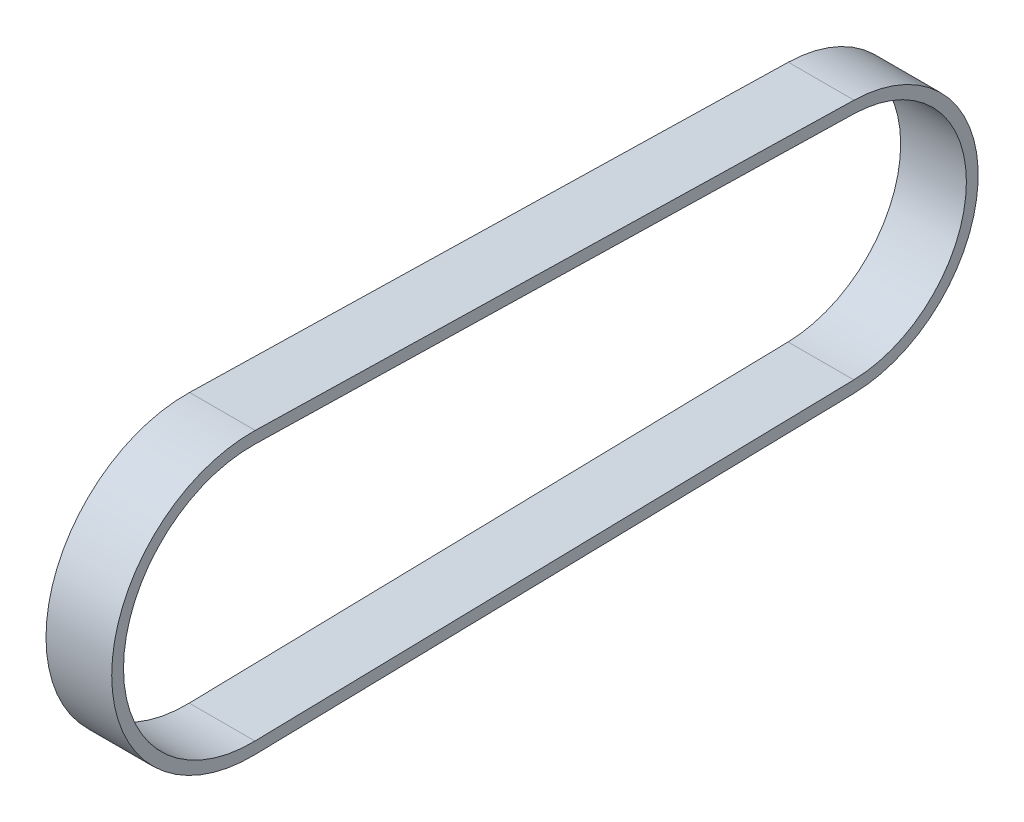
ISO-10303-21;
HEADER;
FILE_DESCRIPTION(('STEP AP214'),'2;1');
FILE_NAME('part.step','',(''),(''),'','','');
FILE_SCHEMA(('AUTOMOTIVE_DESIGN { 1 0 10303 214 1 1 1 1 }'));
ENDSEC;
DATA;
#1=APPLICATION_CONTEXT('core data for automotive mechanical design processes');
#2=APPLICATION_PROTOCOL_DEFINITION('international standard','automotive_design',2000,#1);
#3=PRODUCT_CONTEXT('',#1,'mechanical');
#4=PRODUCT('Part','Part','',(#3));
#5=PRODUCT_RELATED_PRODUCT_CATEGORY('part','',(#4));
#6=PRODUCT_DEFINITION_FORMATION('','',#4);
#7=PRODUCT_DEFINITION_CONTEXT('part definition',#1,'design');
#8=PRODUCT_DEFINITION('design','',#6,#7);
#9=PRODUCT_DEFINITION_SHAPE('','',#8);
#10=(LENGTH_UNIT() NAMED_UNIT(*) SI_UNIT(.MILLI.,.METRE.));
#11=(NAMED_UNIT(*) PLANE_ANGLE_UNIT() SI_UNIT($,.RADIAN.));
#12=(NAMED_UNIT(*) SI_UNIT($,.STERADIAN.) SOLID_ANGLE_UNIT());
#13=UNCERTAINTY_MEASURE_WITH_UNIT(LENGTH_MEASURE(1.E-05),#10,'distance_accuracy_value','');
#14=(GEOMETRIC_REPRESENTATION_CONTEXT(3) GLOBAL_UNCERTAINTY_ASSIGNED_CONTEXT((#13)) GLOBAL_UNIT_ASSIGNED_CONTEXT((#10,
#11,#12)) REPRESENTATION_CONTEXT('',''));
#15=CARTESIAN_POINT('',(0.,0.,0.));
#16=DIRECTION('',(0.,0.,1.));
#17=DIRECTION('',(1.,0.,0.));
#18=AXIS2_PLACEMENT_3D('',#15,#16,#17);
#19=CARTESIAN_POINT('',(6.35,0.,0.));
#20=DIRECTION('',(-1.,0.,0.));
#21=DIRECTION('',(0.,0.,1.));
#22=AXIS2_PLACEMENT_3D('',#19,#20,#21);
#23=PLANE('',#22);
#24=CARTESIAN_POINT('',(6.35,0.,0.));
#25=DIRECTION('',(1.,0.,0.));
#26=DIRECTION('',(0.,0.,1.));
#27=AXIS2_PLACEMENT_3D('',#24,#25,#26);
#28=CIRCLE('',#27,13.5661137745093);
#29=CARTESIAN_POINT('',(6.35,13.5627271504832,-0.303109195629552));
#30=VERTEX_POINT('',#29);
#31=CARTESIAN_POINT('',(6.35,-13.5627271504832,-0.303109195629544));
#32=VERTEX_POINT('',#31);
#33=EDGE_CURVE('E135',#30,#32,#28,.T.);
#34=ORIENTED_EDGE('',*,*,#33,.T.);
#35=DIRECTION('',(0.,0.0223431117170117,-0.999750361519715));
#36=VECTOR('',#35,1.);
#37=CARTESIAN_POINT('',(6.35,-12.2694387082106,-58.171753639046));
#38=LINE('',#37,#36);
#39=CARTESIAN_POINT('',(6.35,-12.2694387082106,-58.171753639046));
#40=VERTEX_POINT('',#39);
#41=EDGE_CURVE('E138',#32,#40,#38,.T.);
#42=ORIENTED_EDGE('',*,*,#41,.T.);
#43=CARTESIAN_POINT('',(6.35,0.,-57.8975477469412));
#44=DIRECTION('',(1.,0.,0.));
#45=DIRECTION('',(0.,0.,1.));
#46=AXIS2_PLACEMENT_3D('',#43,#44,#45);
#47=CIRCLE('',#46,12.2725023970583);
#48=CARTESIAN_POINT('',(6.35,12.2694387082106,-58.171753639046));
#49=VERTEX_POINT('',#48);
#50=EDGE_CURVE('E141',#40,#49,#47,.T.);
#51=ORIENTED_EDGE('',*,*,#50,.T.);
#52=DIRECTION('',(0.,0.0223431117170117,0.999750361519715));
#53=VECTOR('',#52,1.);
#54=CARTESIAN_POINT('',(6.35,13.5627271504832,-0.303109195629552));
#55=LINE('',#54,#53);
#56=EDGE_CURVE('E143',#49,#30,#55,.T.);
#57=ORIENTED_EDGE('',*,*,#56,.T.);
#58=EDGE_LOOP('',(#34,#42,#51,#57));
#59=FACE_BOUND('',#58,.T.);
#60=CARTESIAN_POINT('',(6.35,0.,0.));
#61=DIRECTION('',(1.,0.,0.));
#62=DIRECTION('',(0.,0.,1.));
#63=AXIS2_PLACEMENT_3D('',#60,#61,#62);
#64=CIRCLE('',#63,12.4261137745093);
#65=CARTESIAN_POINT('',(6.35,12.4230117383507,-0.277638048272158));
#66=VERTEX_POINT('',#65);
#67=CARTESIAN_POINT('',(6.35,-12.4230117383507,-0.277638048272151));
#68=VERTEX_POINT('',#67);
#69=EDGE_CURVE('E99',#66,#68,#64,.T.);
#70=ORIENTED_EDGE('',*,*,#69,.F.);
#71=DIRECTION('',(0.,0.0223431117170117,0.999750361519715));
#72=VECTOR('',#71,1.);
#73=CARTESIAN_POINT('',(6.35,12.4230117383507,-0.277638048272158));
#74=LINE('',#73,#72);
#75=CARTESIAN_POINT('',(6.35,11.1297232960782,-58.1462824916886));
#76=VERTEX_POINT('',#75);
#77=EDGE_CURVE('E121',#76,#66,#74,.T.);
#78=ORIENTED_EDGE('',*,*,#77,.F.);
#79=CARTESIAN_POINT('',(6.35,0.,-57.8975477469412));
#80=DIRECTION('',(1.,0.,0.));
#81=DIRECTION('',(0.,0.,1.));
#82=AXIS2_PLACEMENT_3D('',#79,#80,#81);
#83=CIRCLE('',#82,11.1325023970583);
#84=CARTESIAN_POINT('',(6.35,-11.1297232960782,-58.1462824916886));
#85=VERTEX_POINT('',#84);
#86=EDGE_CURVE('E119',#85,#76,#83,.T.);
#87=ORIENTED_EDGE('',*,*,#86,.F.);
#88=DIRECTION('',(0.,0.0223431117170117,-0.999750361519715));
#89=VECTOR('',#88,1.);
#90=CARTESIAN_POINT('',(6.35,-11.1297232960782,-58.1462824916886));
#91=LINE('',#90,#89);
#92=EDGE_CURVE('E107',#68,#85,#91,.T.);
#93=ORIENTED_EDGE('',*,*,#92,.F.);
#94=EDGE_LOOP('',(#70,#78,#87,#93));
#95=FACE_BOUND('',#94,.T.);
#96=ADVANCED_FACE('F34',(#59,#95),#23,.F.);
#97=CARTESIAN_POINT('',(0.,0.,0.));
#98=DIRECTION('',(-1.,0.,0.));
#99=DIRECTION('',(0.,0.,1.));
#100=AXIS2_PLACEMENT_3D('',#97,#98,#99);
#101=PLANE('',#100);
#102=CARTESIAN_POINT('',(0.,0.,0.));
#103=DIRECTION('',(1.,0.,0.));
#104=DIRECTION('',(0.,0.,1.));
#105=AXIS2_PLACEMENT_3D('',#102,#103,#104);
#106=CIRCLE('',#105,13.5661137745093);
#107=CARTESIAN_POINT('',(0.,13.5627271504832,-0.303109195629552));
#108=VERTEX_POINT('',#107);
#109=CARTESIAN_POINT('',(0.,-13.5627271504832,-0.303109195629544));
#110=VERTEX_POINT('',#109);
#111=EDGE_CURVE('E115',#108,#110,#106,.T.);
#112=ORIENTED_EDGE('',*,*,#111,.F.);
#113=DIRECTION('',(0.,0.0223431117170117,0.999750361519715));
#114=VECTOR('',#113,1.);
#115=CARTESIAN_POINT('',(0.,13.5627271504832,-0.303109195629552));
#116=LINE('',#115,#114);
#117=CARTESIAN_POINT('',(0.,12.2694387082106,-58.171753639046));
#118=VERTEX_POINT('',#117);
#119=EDGE_CURVE('E139',#118,#108,#116,.T.);
#120=ORIENTED_EDGE('',*,*,#119,.F.);
#121=CARTESIAN_POINT('',(0.,0.,-57.8975477469412));
#122=DIRECTION('',(1.,0.,0.));
#123=DIRECTION('',(0.,0.,1.));
#124=AXIS2_PLACEMENT_3D('',#121,#122,#123);
#125=CIRCLE('',#124,12.2725023970583);
#126=CARTESIAN_POINT('',(0.,-12.2694387082106,-58.171753639046));
#127=VERTEX_POINT('',#126);
#128=EDGE_CURVE('E150',#127,#118,#125,.T.);
#129=ORIENTED_EDGE('',*,*,#128,.F.);
#130=DIRECTION('',(0.,0.0223431117170117,-0.999750361519715));
#131=VECTOR('',#130,1.);
#132=CARTESIAN_POINT('',(0.,-12.2694387082106,-58.171753639046));
#133=LINE('',#132,#131);
#134=EDGE_CURVE('E148',#110,#127,#133,.T.);
#135=ORIENTED_EDGE('',*,*,#134,.F.);
#136=EDGE_LOOP('',(#112,#120,#129,#135));
#137=FACE_BOUND('',#136,.T.);
#138=DIRECTION('',(0.,0.0223431117170117,0.999750361519715));
#139=VECTOR('',#138,1.);
#140=CARTESIAN_POINT('',(0.,12.4230117383507,-0.277638048272158));
#141=LINE('',#140,#139);
#142=CARTESIAN_POINT('',(0.,11.1297232960782,-58.1462824916886));
#143=VERTEX_POINT('',#142);
#144=CARTESIAN_POINT('',(0.,12.4230117383507,-0.277638048272158));
#145=VERTEX_POINT('',#144);
#146=EDGE_CURVE('E108',#143,#145,#141,.T.);
#147=ORIENTED_EDGE('',*,*,#146,.T.);
#148=CARTESIAN_POINT('',(0.,0.,0.));
#149=DIRECTION('',(1.,0.,0.));
#150=DIRECTION('',(0.,0.,1.));
#151=AXIS2_PLACEMENT_3D('',#148,#149,#150);
#152=CIRCLE('',#151,12.4261137745093);
#153=CARTESIAN_POINT('',(0.,-12.4230117383507,-0.277638048272151));
#154=VERTEX_POINT('',#153);
#155=EDGE_CURVE('E57',#145,#154,#152,.T.);
#156=ORIENTED_EDGE('',*,*,#155,.T.);
#157=DIRECTION('',(0.,0.0223431117170117,-0.999750361519715));
#158=VECTOR('',#157,1.);
#159=CARTESIAN_POINT('',(0.,-11.1297232960782,-58.1462824916886));
#160=LINE('',#159,#158);
#161=CARTESIAN_POINT('',(0.,-11.1297232960782,-58.1462824916886));
#162=VERTEX_POINT('',#161);
#163=EDGE_CURVE('E114',#154,#162,#160,.T.);
#164=ORIENTED_EDGE('',*,*,#163,.T.);
#165=CARTESIAN_POINT('',(0.,0.,-57.8975477469412));
#166=DIRECTION('',(1.,0.,0.));
#167=DIRECTION('',(0.,0.,1.));
#168=AXIS2_PLACEMENT_3D('',#165,#166,#167);
#169=CIRCLE('',#168,11.1325023970583);
#170=EDGE_CURVE('E127',#162,#143,#169,.T.);
#171=ORIENTED_EDGE('',*,*,#170,.T.);
#172=EDGE_LOOP('',(#147,#156,#164,#171));
#173=FACE_BOUND('',#172,.T.);
#174=ADVANCED_FACE('F168',(#137,#173),#101,.T.);
#175=CARTESIAN_POINT('',(6.35,0.,0.));
#176=DIRECTION('',(-1.,0.,0.));
#177=DIRECTION('',(0.,0.,1.));
#178=AXIS2_PLACEMENT_3D('',#175,#176,#177);
#179=CYLINDRICAL_SURFACE('',#178,13.5661137745093);
#180=ORIENTED_EDGE('',*,*,#111,.T.);
#181=DIRECTION('',(-1.,0.,0.));
#182=VECTOR('',#181,1.);
#183=CARTESIAN_POINT('',(6.35,-13.5627271504832,-0.303109195629544));
#184=LINE('',#183,#182);
#185=EDGE_CURVE('E11',#32,#110,#184,.T.);
#186=ORIENTED_EDGE('',*,*,#185,.F.);
#187=ORIENTED_EDGE('',*,*,#33,.F.);
#188=DIRECTION('',(-1.,0.,0.));
#189=VECTOR('',#188,1.);
#190=CARTESIAN_POINT('',(6.35,13.5627271504832,-0.303109195629552));
#191=LINE('',#190,#189);
#192=EDGE_CURVE('E145',#30,#108,#191,.T.);
#193=ORIENTED_EDGE('',*,*,#192,.T.);
#194=EDGE_LOOP('',(#180,#186,#187,#193));
#195=FACE_BOUND('',#194,.T.);
#196=ADVANCED_FACE('F36',(#195),#179,.T.);
#197=CARTESIAN_POINT('',(6.35,-12.2694387082106,-58.171753639046));
#198=DIRECTION('',(0.,0.999750361519715,0.0223431117170117));
#199=DIRECTION('',(0.,-0.0223431117170117,0.999750361519715));
#200=AXIS2_PLACEMENT_3D('',#197,#198,#199);
#201=PLANE('',#200);
#202=ORIENTED_EDGE('',*,*,#134,.T.);
#203=DIRECTION('',(-1.,0.,0.));
#204=VECTOR('',#203,1.);
#205=CARTESIAN_POINT('',(6.35,-12.2694387082106,-58.171753639046));
#206=LINE('',#205,#204);
#207=EDGE_CURVE('E42',#40,#127,#206,.T.);
#208=ORIENTED_EDGE('',*,*,#207,.F.);
#209=ORIENTED_EDGE('',*,*,#41,.F.);
#210=ORIENTED_EDGE('',*,*,#185,.T.);
#211=EDGE_LOOP('',(#202,#208,#209,#210));
#212=FACE_BOUND('',#211,.T.);
#213=ADVANCED_FACE('F178',(#212),#201,.F.);
#214=CARTESIAN_POINT('',(6.35,0.,-57.8975477469412));
#215=DIRECTION('',(-1.,0.,0.));
#216=DIRECTION('',(0.,0.,1.));
#217=AXIS2_PLACEMENT_3D('',#214,#215,#216);
#218=CYLINDRICAL_SURFACE('',#217,12.2725023970583);
#219=ORIENTED_EDGE('',*,*,#128,.T.);
#220=DIRECTION('',(-1.,0.,0.));
#221=VECTOR('',#220,1.);
#222=CARTESIAN_POINT('',(6.35,12.2694387082106,-58.171753639046));
#223=LINE('',#222,#221);
#224=EDGE_CURVE('E155',#49,#118,#223,.T.);
#225=ORIENTED_EDGE('',*,*,#224,.F.);
#226=ORIENTED_EDGE('',*,*,#50,.F.);
#227=ORIENTED_EDGE('',*,*,#207,.T.);
#228=EDGE_LOOP('',(#219,#225,#226,#227));
#229=FACE_BOUND('',#228,.T.);
#230=ADVANCED_FACE('F162',(#229),#218,.T.);
#231=CARTESIAN_POINT('',(6.35,13.5627271504832,-0.303109195629552));
#232=DIRECTION('',(0.,-0.999750361519715,0.0223431117170117));
#233=DIRECTION('',(0.,-0.0223431117170117,-0.999750361519715));
#234=AXIS2_PLACEMENT_3D('',#231,#232,#233);
#235=PLANE('',#234);
#236=ORIENTED_EDGE('',*,*,#119,.T.);
#237=ORIENTED_EDGE('',*,*,#192,.F.);
#238=ORIENTED_EDGE('',*,*,#56,.F.);
#239=ORIENTED_EDGE('',*,*,#224,.T.);
#240=EDGE_LOOP('',(#236,#237,#238,#239));
#241=FACE_BOUND('',#240,.T.);
#242=ADVANCED_FACE('F172',(#241),#235,.F.);
#243=CARTESIAN_POINT('',(6.35,0.,0.));
#244=DIRECTION('',(-1.,0.,0.));
#245=DIRECTION('',(0.,0.,1.));
#246=AXIS2_PLACEMENT_3D('',#243,#244,#245);
#247=CYLINDRICAL_SURFACE('',#246,12.4261137745093);
#248=ORIENTED_EDGE('',*,*,#155,.F.);
#249=DIRECTION('',(-1.,0.,0.));
#250=VECTOR('',#249,1.);
#251=CARTESIAN_POINT('',(6.35,12.4230117383507,-0.277638048272158));
#252=LINE('',#251,#250);
#253=EDGE_CURVE('E103',#66,#145,#252,.T.);
#254=ORIENTED_EDGE('',*,*,#253,.F.);
#255=ORIENTED_EDGE('',*,*,#69,.T.);
#256=DIRECTION('',(-1.,0.,0.));
#257=VECTOR('',#256,1.);
#258=CARTESIAN_POINT('',(6.35,-12.4230117383507,-0.277638048272151));
#259=LINE('',#258,#257);
#260=EDGE_CURVE('E102',#68,#154,#259,.T.);
#261=ORIENTED_EDGE('',*,*,#260,.T.);
#262=EDGE_LOOP('',(#248,#254,#255,#261));
#263=FACE_BOUND('',#262,.T.);
#264=ADVANCED_FACE('F101',(#263),#247,.F.);
#265=CARTESIAN_POINT('',(6.35,-11.1297232960782,-58.1462824916886));
#266=DIRECTION('',(0.,0.999750361519715,0.0223431117170117));
#267=DIRECTION('',(0.,-0.0223431117170117,0.999750361519715));
#268=AXIS2_PLACEMENT_3D('',#265,#266,#267);
#269=PLANE('',#268);
#270=ORIENTED_EDGE('',*,*,#163,.F.);
#271=ORIENTED_EDGE('',*,*,#260,.F.);
#272=ORIENTED_EDGE('',*,*,#92,.T.);
#273=DIRECTION('',(-1.,0.,0.));
#274=VECTOR('',#273,1.);
#275=CARTESIAN_POINT('',(6.35,-11.1297232960782,-58.1462824916886));
#276=LINE('',#275,#274);
#277=EDGE_CURVE('E116',#85,#162,#276,.T.);
#278=ORIENTED_EDGE('',*,*,#277,.T.);
#279=EDGE_LOOP('',(#270,#271,#272,#278));
#280=FACE_BOUND('',#279,.T.);
#281=ADVANCED_FACE('F111',(#280),#269,.T.);
#282=CARTESIAN_POINT('',(6.35,0.,-57.8975477469412));
#283=DIRECTION('',(-1.,0.,0.));
#284=DIRECTION('',(0.,0.,1.));
#285=AXIS2_PLACEMENT_3D('',#282,#283,#284);
#286=CYLINDRICAL_SURFACE('',#285,11.1325023970583);
#287=ORIENTED_EDGE('',*,*,#170,.F.);
#288=ORIENTED_EDGE('',*,*,#277,.F.);
#289=ORIENTED_EDGE('',*,*,#86,.T.);
#290=DIRECTION('',(-1.,0.,0.));
#291=VECTOR('',#290,1.);
#292=CARTESIAN_POINT('',(6.35,11.1297232960782,-58.1462824916886));
#293=LINE('',#292,#291);
#294=EDGE_CURVE('E49',#76,#143,#293,.T.);
#295=ORIENTED_EDGE('',*,*,#294,.T.);
#296=EDGE_LOOP('',(#287,#288,#289,#295));
#297=FACE_BOUND('',#296,.T.);
#298=ADVANCED_FACE('F201',(#297),#286,.F.);
#299=CARTESIAN_POINT('',(6.35,12.4230117383507,-0.277638048272158));
#300=DIRECTION('',(0.,-0.999750361519715,0.0223431117170117));
#301=DIRECTION('',(0.,-0.0223431117170117,-0.999750361519715));
#302=AXIS2_PLACEMENT_3D('',#299,#300,#301);
#303=PLANE('',#302);
#304=ORIENTED_EDGE('',*,*,#146,.F.);
#305=ORIENTED_EDGE('',*,*,#294,.F.);
#306=ORIENTED_EDGE('',*,*,#77,.T.);
#307=ORIENTED_EDGE('',*,*,#253,.T.);
#308=EDGE_LOOP('',(#304,#305,#306,#307));
#309=FACE_BOUND('',#308,.T.);
#310=ADVANCED_FACE('F205',(#309),#303,.T.);
#311=CLOSED_SHELL('',(#96,#174,#196,#213,#230,#242,#264,#281,#298,#310));
#312=MANIFOLD_SOLID_BREP('B2',#311);
#313=ADVANCED_BREP_SHAPE_REPRESENTATION('',(#18,#312),#14);
#314=SHAPE_DEFINITION_REPRESENTATION(#9,#313);
ENDSEC;
END-ISO-10303-21;
